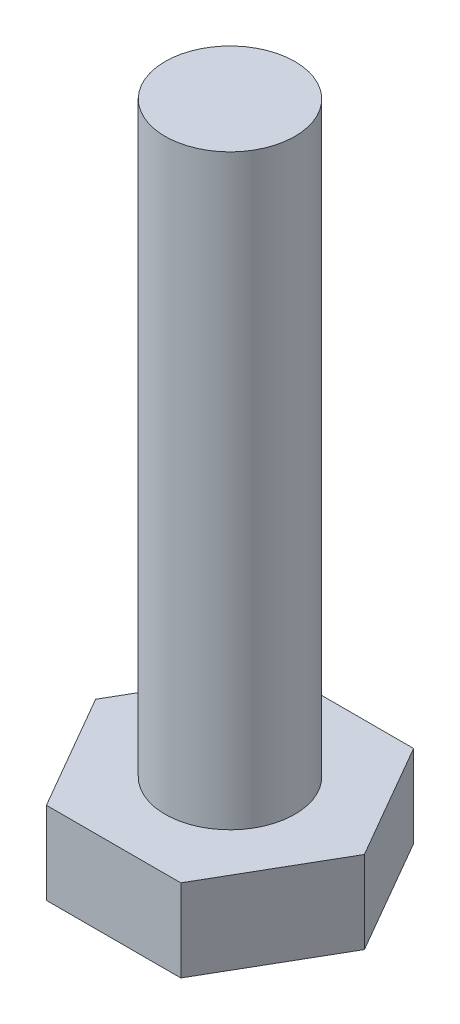
ISO-10303-21;
HEADER;
FILE_DESCRIPTION(('STEP AP214'),'2;1');
FILE_NAME('part.step','',(''),(''),'','','');
FILE_SCHEMA(('AUTOMOTIVE_DESIGN { 1 0 10303 214 1 1 1 1 }'));
ENDSEC;
DATA;
#1=APPLICATION_CONTEXT('core data for automotive mechanical design processes');
#2=APPLICATION_PROTOCOL_DEFINITION('international standard','automotive_design',2000,#1);
#3=PRODUCT_CONTEXT('',#1,'mechanical');
#4=PRODUCT('Part','Part','',(#3));
#5=PRODUCT_RELATED_PRODUCT_CATEGORY('part','',(#4));
#6=PRODUCT_DEFINITION_FORMATION('','',#4);
#7=PRODUCT_DEFINITION_CONTEXT('part definition',#1,'design');
#8=PRODUCT_DEFINITION('design','',#6,#7);
#9=PRODUCT_DEFINITION_SHAPE('','',#8);
#10=(LENGTH_UNIT() NAMED_UNIT(*) SI_UNIT(.MILLI.,.METRE.));
#11=(NAMED_UNIT(*) PLANE_ANGLE_UNIT() SI_UNIT($,.RADIAN.));
#12=(NAMED_UNIT(*) SI_UNIT($,.STERADIAN.) SOLID_ANGLE_UNIT());
#13=UNCERTAINTY_MEASURE_WITH_UNIT(LENGTH_MEASURE(1.E-05),#10,'distance_accuracy_value','');
#14=(GEOMETRIC_REPRESENTATION_CONTEXT(3) GLOBAL_UNCERTAINTY_ASSIGNED_CONTEXT((#13)) GLOBAL_UNIT_ASSIGNED_CONTEXT((#10,
#11,#12)) REPRESENTATION_CONTEXT('',''));
#15=CARTESIAN_POINT('',(0.,0.,0.));
#16=DIRECTION('',(0.,0.,1.));
#17=DIRECTION('',(1.,0.,0.));
#18=AXIS2_PLACEMENT_3D('',#15,#16,#17);
#19=CARTESIAN_POINT('',(6.52405804184277,4.,0.));
#20=DIRECTION('',(-0.866025403784438,0.,0.5));
#21=DIRECTION('',(0.5,0.,0.866025403784438));
#22=AXIS2_PLACEMENT_3D('',#19,#20,#21);
#23=PLANE('',#22);
#24=DIRECTION('',(-0.5,0.,-0.866025403784438));
#25=VECTOR('',#24,1.);
#26=CARTESIAN_POINT('',(6.52405804184277,0.,0.));
#27=LINE('',#26,#25);
#28=CARTESIAN_POINT('',(6.52405804184277,0.,0.));
#29=VERTEX_POINT('',#28);
#30=CARTESIAN_POINT('',(3.26202902092139,0.,-5.65));
#31=VERTEX_POINT('',#30);
#32=EDGE_CURVE('E126',#29,#31,#27,.T.);
#33=ORIENTED_EDGE('',*,*,#32,.T.);
#34=DIRECTION('',(0.,-1.,0.));
#35=VECTOR('',#34,1.);
#36=CARTESIAN_POINT('',(3.26202902092139,4.,-5.65));
#37=LINE('',#36,#35);
#38=CARTESIAN_POINT('',(3.26202902092139,4.,-5.65));
#39=VERTEX_POINT('',#38);
#40=EDGE_CURVE('E43',#39,#31,#37,.T.);
#41=ORIENTED_EDGE('',*,*,#40,.F.);
#42=DIRECTION('',(-0.5,0.,-0.866025403784438));
#43=VECTOR('',#42,1.);
#44=CARTESIAN_POINT('',(6.52405804184277,4.,0.));
#45=LINE('',#44,#43);
#46=CARTESIAN_POINT('',(6.52405804184277,4.,0.));
#47=VERTEX_POINT('',#46);
#48=EDGE_CURVE('E137',#47,#39,#45,.T.);
#49=ORIENTED_EDGE('',*,*,#48,.F.);
#50=DIRECTION('',(0.,-1.,0.));
#51=VECTOR('',#50,1.);
#52=CARTESIAN_POINT('',(6.52405804184277,4.,0.));
#53=LINE('',#52,#51);
#54=EDGE_CURVE('E122',#47,#29,#53,.T.);
#55=ORIENTED_EDGE('',*,*,#54,.T.);
#56=EDGE_LOOP('',(#33,#41,#49,#55));
#57=FACE_BOUND('',#56,.T.);
#58=ADVANCED_FACE('F40',(#57),#23,.F.);
#59=CARTESIAN_POINT('',(-3.26202902092139,4.,-5.65));
#60=DIRECTION('',(0.,0.,1.));
#61=DIRECTION('',(1.,0.,0.));
#62=AXIS2_PLACEMENT_3D('',#59,#60,#61);
#63=PLANE('',#62);
#64=DIRECTION('',(-1.,0.,0.));
#65=VECTOR('',#64,1.);
#66=CARTESIAN_POINT('',(-3.26202902092139,0.,-5.65));
#67=LINE('',#66,#65);
#68=CARTESIAN_POINT('',(-3.26202902092139,0.,-5.65));
#69=VERTEX_POINT('',#68);
#70=EDGE_CURVE('E129',#31,#69,#67,.T.);
#71=ORIENTED_EDGE('',*,*,#70,.T.);
#72=DIRECTION('',(0.,-1.,0.));
#73=VECTOR('',#72,1.);
#74=CARTESIAN_POINT('',(-3.26202902092139,4.,-5.65));
#75=LINE('',#74,#73);
#76=CARTESIAN_POINT('',(-3.26202902092139,4.,-5.65));
#77=VERTEX_POINT('',#76);
#78=EDGE_CURVE('E140',#77,#69,#75,.T.);
#79=ORIENTED_EDGE('',*,*,#78,.F.);
#80=DIRECTION('',(-1.,0.,0.));
#81=VECTOR('',#80,1.);
#82=CARTESIAN_POINT('',(-3.26202902092139,4.,-5.65));
#83=LINE('',#82,#81);
#84=EDGE_CURVE('E95',#39,#77,#83,.T.);
#85=ORIENTED_EDGE('',*,*,#84,.F.);
#86=ORIENTED_EDGE('',*,*,#40,.T.);
#87=EDGE_LOOP('',(#71,#79,#85,#86));
#88=FACE_BOUND('',#87,.T.);
#89=ADVANCED_FACE('F145',(#88),#63,.F.);
#90=CARTESIAN_POINT('',(-3.26202902092139,4.,-5.65));
#91=DIRECTION('',(0.866025403784439,0.,0.499999999999999));
#92=DIRECTION('',(0.499999999999999,0.,-0.866025403784439));
#93=AXIS2_PLACEMENT_3D('',#90,#91,#92);
#94=PLANE('',#93);
#95=DIRECTION('',(-0.499999999999999,0.,0.866025403784439));
#96=VECTOR('',#95,1.);
#97=CARTESIAN_POINT('',(-3.26202902092139,0.,-5.65));
#98=LINE('',#97,#96);
#99=CARTESIAN_POINT('',(-6.52405804184277,0.,0.));
#100=VERTEX_POINT('',#99);
#101=EDGE_CURVE('E132',#69,#100,#98,.T.);
#102=ORIENTED_EDGE('',*,*,#101,.T.);
#103=DIRECTION('',(0.,-1.,0.));
#104=VECTOR('',#103,1.);
#105=CARTESIAN_POINT('',(-6.52405804184277,4.,0.));
#106=LINE('',#105,#104);
#107=CARTESIAN_POINT('',(-6.52405804184277,4.,0.));
#108=VERTEX_POINT('',#107);
#109=EDGE_CURVE('E117',#108,#100,#106,.T.);
#110=ORIENTED_EDGE('',*,*,#109,.F.);
#111=DIRECTION('',(-0.499999999999999,0.,0.866025403784439));
#112=VECTOR('',#111,1.);
#113=CARTESIAN_POINT('',(-3.26202902092139,4.,-5.65));
#114=LINE('',#113,#112);
#115=EDGE_CURVE('E108',#77,#108,#114,.T.);
#116=ORIENTED_EDGE('',*,*,#115,.F.);
#117=ORIENTED_EDGE('',*,*,#78,.T.);
#118=EDGE_LOOP('',(#102,#110,#116,#117));
#119=FACE_BOUND('',#118,.T.);
#120=ADVANCED_FACE('F151',(#119),#94,.F.);
#121=CARTESIAN_POINT('',(-3.26202902092139,4.,5.65));
#122=DIRECTION('',(0.866025403784439,0.,-0.5));
#123=DIRECTION('',(-0.5,0.,-0.866025403784439));
#124=AXIS2_PLACEMENT_3D('',#121,#122,#123);
#125=PLANE('',#124);
#126=DIRECTION('',(0.5,0.,0.866025403784439));
#127=VECTOR('',#126,1.);
#128=CARTESIAN_POINT('',(-3.26202902092139,0.,5.65));
#129=LINE('',#128,#127);
#130=CARTESIAN_POINT('',(-3.26202902092139,0.,5.65));
#131=VERTEX_POINT('',#130);
#132=EDGE_CURVE('E116',#100,#131,#129,.T.);
#133=ORIENTED_EDGE('',*,*,#132,.T.);
#134=DIRECTION('',(0.,-1.,0.));
#135=VECTOR('',#134,1.);
#136=CARTESIAN_POINT('',(-3.26202902092139,4.,5.65));
#137=LINE('',#136,#135);
#138=CARTESIAN_POINT('',(-3.26202902092139,4.,5.65));
#139=VERTEX_POINT('',#138);
#140=EDGE_CURVE('E113',#139,#131,#137,.T.);
#141=ORIENTED_EDGE('',*,*,#140,.F.);
#142=DIRECTION('',(0.5,0.,0.866025403784439));
#143=VECTOR('',#142,1.);
#144=CARTESIAN_POINT('',(-3.26202902092139,4.,5.65));
#145=LINE('',#144,#143);
#146=EDGE_CURVE('E102',#108,#139,#145,.T.);
#147=ORIENTED_EDGE('',*,*,#146,.F.);
#148=ORIENTED_EDGE('',*,*,#109,.T.);
#149=EDGE_LOOP('',(#133,#141,#147,#148));
#150=FACE_BOUND('',#149,.T.);
#151=ADVANCED_FACE('F114',(#150),#125,.F.);
#152=CARTESIAN_POINT('',(-3.26202902092139,4.,5.65));
#153=DIRECTION('',(0.,0.,-1.));
#154=DIRECTION('',(-1.,0.,0.));
#155=AXIS2_PLACEMENT_3D('',#152,#153,#154);
#156=PLANE('',#155);
#157=DIRECTION('',(1.,0.,0.));
#158=VECTOR('',#157,1.);
#159=CARTESIAN_POINT('',(-3.26202902092139,0.,5.65));
#160=LINE('',#159,#158);
#161=CARTESIAN_POINT('',(3.26202902092139,0.,5.65));
#162=VERTEX_POINT('',#161);
#163=EDGE_CURVE('E80',#131,#162,#160,.T.);
#164=ORIENTED_EDGE('',*,*,#163,.T.);
#165=DIRECTION('',(0.,-1.,0.));
#166=VECTOR('',#165,1.);
#167=CARTESIAN_POINT('',(3.26202902092139,4.,5.65));
#168=LINE('',#167,#166);
#169=CARTESIAN_POINT('',(3.26202902092139,4.,5.65));
#170=VERTEX_POINT('',#169);
#171=EDGE_CURVE('E118',#170,#162,#168,.T.);
#172=ORIENTED_EDGE('',*,*,#171,.F.);
#173=DIRECTION('',(1.,0.,0.));
#174=VECTOR('',#173,1.);
#175=CARTESIAN_POINT('',(-3.26202902092139,4.,5.65));
#176=LINE('',#175,#174);
#177=EDGE_CURVE('E106',#139,#170,#176,.T.);
#178=ORIENTED_EDGE('',*,*,#177,.F.);
#179=ORIENTED_EDGE('',*,*,#140,.T.);
#180=EDGE_LOOP('',(#164,#172,#178,#179));
#181=FACE_BOUND('',#180,.T.);
#182=ADVANCED_FACE('F120',(#181),#156,.F.);
#183=CARTESIAN_POINT('',(6.52405804184277,4.,0.));
#184=DIRECTION('',(-0.866025403784439,0.,-0.5));
#185=DIRECTION('',(-0.5,0.,0.866025403784439));
#186=AXIS2_PLACEMENT_3D('',#183,#184,#185);
#187=PLANE('',#186);
#188=DIRECTION('',(0.5,0.,-0.866025403784439));
#189=VECTOR('',#188,1.);
#190=CARTESIAN_POINT('',(6.52405804184277,0.,0.));
#191=LINE('',#190,#189);
#192=EDGE_CURVE('E86',#162,#29,#191,.T.);
#193=ORIENTED_EDGE('',*,*,#192,.T.);
#194=ORIENTED_EDGE('',*,*,#54,.F.);
#195=DIRECTION('',(0.5,0.,-0.866025403784439));
#196=VECTOR('',#195,1.);
#197=CARTESIAN_POINT('',(6.52405804184277,4.,0.));
#198=LINE('',#197,#196);
#199=EDGE_CURVE('E57',#170,#47,#198,.T.);
#200=ORIENTED_EDGE('',*,*,#199,.F.);
#201=ORIENTED_EDGE('',*,*,#171,.T.);
#202=EDGE_LOOP('',(#193,#194,#200,#201));
#203=FACE_BOUND('',#202,.T.);
#204=ADVANCED_FACE('F167',(#203),#187,.F.);
#205=CARTESIAN_POINT('',(0.,4.,0.));
#206=DIRECTION('',(0.,-1.,0.));
#207=DIRECTION('',(0.,0.,-1.));
#208=AXIS2_PLACEMENT_3D('',#205,#206,#207);
#209=PLANE('',#208);
#210=CARTESIAN_POINT('',(0.,4.,0.));
#211=DIRECTION('',(0.,1.,0.));
#212=DIRECTION('',(0.,0.,1.));
#213=AXIS2_PLACEMENT_3D('',#210,#211,#212);
#214=CIRCLE('',#213,3.15);
#215=CARTESIAN_POINT('',(0.,4.,-3.15));
#216=VERTEX_POINT('',#215);
#217=EDGE_CURVE('E11',#216,#216,#214,.T.);
#218=ORIENTED_EDGE('',*,*,#217,.F.);
#219=EDGE_LOOP('',(#218));
#220=FACE_BOUND('',#219,.T.);
#221=ORIENTED_EDGE('',*,*,#48,.T.);
#222=ORIENTED_EDGE('',*,*,#84,.T.);
#223=ORIENTED_EDGE('',*,*,#115,.T.);
#224=ORIENTED_EDGE('',*,*,#146,.T.);
#225=ORIENTED_EDGE('',*,*,#177,.T.);
#226=ORIENTED_EDGE('',*,*,#199,.T.);
#227=EDGE_LOOP('',(#221,#222,#223,#224,#225,#226));
#228=FACE_BOUND('',#227,.T.);
#229=ADVANCED_FACE('F104',(#220,#228),#209,.F.);
#230=CARTESIAN_POINT('',(0.,0.,0.));
#231=DIRECTION('',(0.,-1.,0.));
#232=DIRECTION('',(0.,0.,-1.));
#233=AXIS2_PLACEMENT_3D('',#230,#231,#232);
#234=PLANE('',#233);
#235=ORIENTED_EDGE('',*,*,#32,.F.);
#236=ORIENTED_EDGE('',*,*,#192,.F.);
#237=ORIENTED_EDGE('',*,*,#163,.F.);
#238=ORIENTED_EDGE('',*,*,#132,.F.);
#239=ORIENTED_EDGE('',*,*,#101,.F.);
#240=ORIENTED_EDGE('',*,*,#70,.F.);
#241=EDGE_LOOP('',(#235,#236,#237,#238,#239,#240));
#242=FACE_BOUND('',#241,.T.);
#243=ADVANCED_FACE('F150',(#242),#234,.T.);
#244=CARTESIAN_POINT('',(0.,32.5,0.));
#245=DIRECTION('',(0.,-1.,0.));
#246=DIRECTION('',(0.,0.,-1.));
#247=AXIS2_PLACEMENT_3D('',#244,#245,#246);
#248=CYLINDRICAL_SURFACE('',#247,3.15);
#249=CARTESIAN_POINT('',(0.,32.5,0.));
#250=DIRECTION('',(0.,1.,0.));
#251=DIRECTION('',(0.,0.,1.));
#252=AXIS2_PLACEMENT_3D('',#249,#250,#251);
#253=CIRCLE('',#252,3.15);
#254=CARTESIAN_POINT('',(0.,32.5,-3.15));
#255=VERTEX_POINT('',#254);
#256=EDGE_CURVE('E130',#255,#255,#253,.T.);
#257=CARTESIAN_POINT('',(0.,32.5,-3.15));
#258=CARTESIAN_POINT('',(0.,32.203125,-3.15));
#259=CARTESIAN_POINT('',(0.,31.90625,-3.15));
#260=CARTESIAN_POINT('',(0.,31.3125,-3.15));
#261=CARTESIAN_POINT('',(0.,31.015625,-3.15));
#262=CARTESIAN_POINT('',(0.,30.421875,-3.15));
#263=CARTESIAN_POINT('',(0.,30.125,-3.15));
#264=CARTESIAN_POINT('',(0.,29.53125,-3.15));
#265=CARTESIAN_POINT('',(0.,29.234375,-3.15));
#266=CARTESIAN_POINT('',(0.,28.640625,-3.15));
#267=CARTESIAN_POINT('',(0.,28.34375,-3.15));
#268=CARTESIAN_POINT('',(0.,27.75,-3.15));
#269=CARTESIAN_POINT('',(0.,27.453125,-3.15));
#270=CARTESIAN_POINT('',(0.,26.859375,-3.15));
#271=CARTESIAN_POINT('',(0.,26.5625,-3.15));
#272=CARTESIAN_POINT('',(0.,25.96875,-3.15));
#273=CARTESIAN_POINT('',(0.,25.671875,-3.15));
#274=CARTESIAN_POINT('',(0.,25.078125,-3.15));
#275=CARTESIAN_POINT('',(0.,24.78125,-3.15));
#276=CARTESIAN_POINT('',(0.,24.1875,-3.15));
#277=CARTESIAN_POINT('',(0.,23.890625,-3.15));
#278=CARTESIAN_POINT('',(0.,23.296875,-3.15));
#279=CARTESIAN_POINT('',(0.,23.,-3.15));
#280=CARTESIAN_POINT('',(0.,22.40625,-3.15));
#281=CARTESIAN_POINT('',(0.,22.109375,-3.15));
#282=CARTESIAN_POINT('',(0.,21.515625,-3.15));
#283=CARTESIAN_POINT('',(0.,21.21875,-3.15));
#284=CARTESIAN_POINT('',(0.,20.625,-3.15));
#285=CARTESIAN_POINT('',(0.,20.328125,-3.15));
#286=CARTESIAN_POINT('',(0.,19.734375,-3.15));
#287=CARTESIAN_POINT('',(0.,19.4375,-3.15));
#288=CARTESIAN_POINT('',(0.,18.84375,-3.15));
#289=CARTESIAN_POINT('',(0.,18.546875,-3.15));
#290=CARTESIAN_POINT('',(0.,17.953125,-3.15));
#291=CARTESIAN_POINT('',(0.,17.65625,-3.15));
#292=CARTESIAN_POINT('',(0.,17.0625,-3.15));
#293=CARTESIAN_POINT('',(0.,16.765625,-3.15));
#294=CARTESIAN_POINT('',(0.,16.171875,-3.15));
#295=CARTESIAN_POINT('',(0.,15.875,-3.15));
#296=CARTESIAN_POINT('',(0.,15.28125,-3.15));
#297=CARTESIAN_POINT('',(0.,14.984375,-3.15));
#298=CARTESIAN_POINT('',(0.,14.390625,-3.15));
#299=CARTESIAN_POINT('',(0.,14.09375,-3.15));
#300=CARTESIAN_POINT('',(0.,13.5,-3.15));
#301=CARTESIAN_POINT('',(0.,13.203125,-3.15));
#302=CARTESIAN_POINT('',(0.,12.609375,-3.15));
#303=CARTESIAN_POINT('',(0.,12.3125,-3.15));
#304=CARTESIAN_POINT('',(0.,11.71875,-3.15));
#305=CARTESIAN_POINT('',(0.,11.421875,-3.15));
#306=CARTESIAN_POINT('',(0.,10.828125,-3.15));
#307=CARTESIAN_POINT('',(0.,10.53125,-3.15));
#308=CARTESIAN_POINT('',(0.,9.9375,-3.15));
#309=CARTESIAN_POINT('',(0.,9.640625,-3.15));
#310=CARTESIAN_POINT('',(0.,9.046875,-3.15));
#311=CARTESIAN_POINT('',(0.,8.75,-3.15));
#312=CARTESIAN_POINT('',(0.,8.15625,-3.15));
#313=CARTESIAN_POINT('',(0.,7.859375,-3.15));
#314=CARTESIAN_POINT('',(0.,7.265625,-3.15));
#315=CARTESIAN_POINT('',(0.,6.96875,-3.15));
#316=CARTESIAN_POINT('',(0.,6.375,-3.15));
#317=CARTESIAN_POINT('',(0.,6.078125,-3.15));
#318=CARTESIAN_POINT('',(0.,5.484375,-3.15));
#319=CARTESIAN_POINT('',(0.,5.1875,-3.15));
#320=CARTESIAN_POINT('',(0.,4.59375,-3.15));
#321=CARTESIAN_POINT('',(0.,4.296875,-3.15));
#322=CARTESIAN_POINT('',(0.,4.,-3.15));
#323=B_SPLINE_CURVE_WITH_KNOTS('',3,(#257,#258,#259,#260,#261,#262,#263,#264,#265,#266,#267,
#268,#269,#270,#271,#272,#273,#274,#275,#276,#277,#278,#279,#280,#281,#282,#283,#284,#285,#286,
#287,#288,#289,#290,#291,#292,#293,#294,#295,#296,#297,#298,#299,#300,#301,#302,#303,#304,#305,
#306,#307,#308,#309,#310,#311,#312,#313,#314,#315,#316,#317,#318,#319,#320,#321,#322),
.UNSPECIFIED.,.F.,.F.,(4,2,2,2,2,2,2,2,2,2,2,2,2,2,2,2,2,2,2,2,2,2,2,2,2,2,2,2,2,2,2,2,4),(0.,
0.890624999999999,1.78125,2.671875,3.5625,4.453125,5.34374999999999,6.234375,7.125,
8.01562499999999,8.90625,9.796875,10.6875,11.578125,12.46875,13.359375,14.25,15.140625,16.03125,
16.921875,17.8125,18.703125,19.59375,20.484375,21.375,22.265625,23.15625,24.046875,24.9375,
25.828125,26.71875,27.609375,28.5),.UNSPECIFIED.);
#324=EDGE_CURVE('BSEAM160',#255,#216,#323,.T.);
#325=ORIENTED_EDGE('',*,*,#256,.F.);
#326=ORIENTED_EDGE('',*,*,#217,.T.);
#327=ORIENTED_EDGE('',*,*,#324,.T.);
#328=ORIENTED_EDGE('',*,*,#324,.F.);
#329=EDGE_LOOP('',(#325,#327,#326,#328));
#330=FACE_BOUND('',#329,.T.);
#331=ADVANCED_FACE('F160',(#330),#248,.T.);
#332=CARTESIAN_POINT('',(0.,32.5,0.));
#333=DIRECTION('',(0.,1.,0.));
#334=DIRECTION('',(0.,0.,1.));
#335=AXIS2_PLACEMENT_3D('',#332,#333,#334);
#336=PLANE('',#335);
#337=ORIENTED_EDGE('',*,*,#256,.T.);
#338=EDGE_LOOP('',(#337));
#339=FACE_BOUND('',#338,.T.);
#340=ADVANCED_FACE('F158',(#339),#336,.T.);
#341=CLOSED_SHELL('',(#58,#89,#120,#151,#182,#204,#229,#243,#331,#340));
#342=MANIFOLD_SOLID_BREP('B2',#341);
#343=ADVANCED_BREP_SHAPE_REPRESENTATION('',(#18,#342),#14);
#344=SHAPE_DEFINITION_REPRESENTATION(#9,#343);
ENDSEC;
END-ISO-10303-21;
